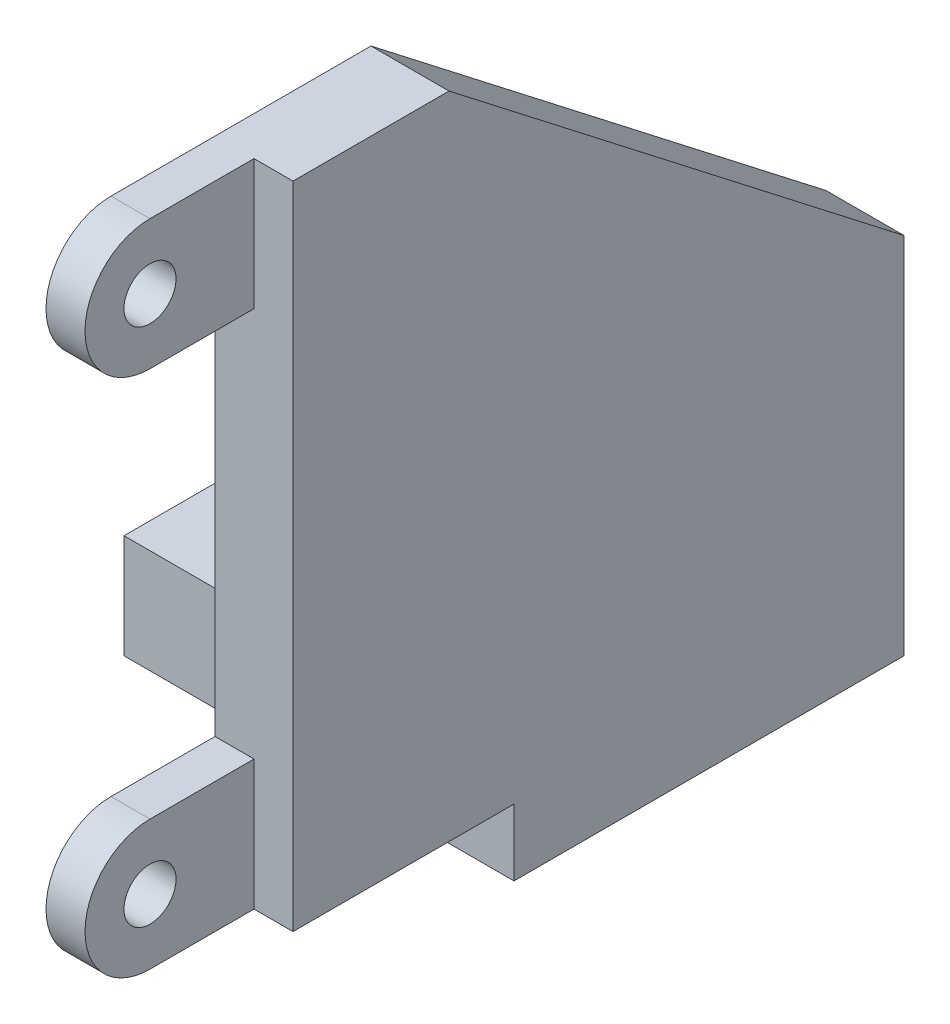
ISO-10303-21;
HEADER;
FILE_DESCRIPTION(('STEP AP214'),'2;1');
FILE_NAME('part.step','',(''),(''),'','','');
FILE_SCHEMA(('AUTOMOTIVE_DESIGN { 1 0 10303 214 1 1 1 1 }'));
ENDSEC;
DATA;
#1=APPLICATION_CONTEXT('core data for automotive mechanical design processes');
#2=APPLICATION_PROTOCOL_DEFINITION('international standard','automotive_design',2000,#1);
#3=PRODUCT_CONTEXT('',#1,'mechanical');
#4=PRODUCT('Part','Part','',(#3));
#5=PRODUCT_RELATED_PRODUCT_CATEGORY('part','',(#4));
#6=PRODUCT_DEFINITION_FORMATION('','',#4);
#7=PRODUCT_DEFINITION_CONTEXT('part definition',#1,'design');
#8=PRODUCT_DEFINITION('design','',#6,#7);
#9=PRODUCT_DEFINITION_SHAPE('','',#8);
#10=(LENGTH_UNIT() NAMED_UNIT(*) SI_UNIT(.MILLI.,.METRE.));
#11=(NAMED_UNIT(*) PLANE_ANGLE_UNIT() SI_UNIT($,.RADIAN.));
#12=(NAMED_UNIT(*) SI_UNIT($,.STERADIAN.) SOLID_ANGLE_UNIT());
#13=UNCERTAINTY_MEASURE_WITH_UNIT(LENGTH_MEASURE(1.E-05),#10,'distance_accuracy_value','');
#14=(GEOMETRIC_REPRESENTATION_CONTEXT(3) GLOBAL_UNCERTAINTY_ASSIGNED_CONTEXT((#13)) GLOBAL_UNIT_ASSIGNED_CONTEXT((#10,
#11,#12)) REPRESENTATION_CONTEXT('',''));
#15=CARTESIAN_POINT('',(0.,0.,0.));
#16=DIRECTION('',(0.,0.,1.));
#17=DIRECTION('',(1.,0.,0.));
#18=AXIS2_PLACEMENT_3D('',#15,#16,#17);
#19=CARTESIAN_POINT('',(0.,8.,-15.));
#20=DIRECTION('',(-1.,0.,0.));
#21=DIRECTION('',(0.,0.,1.));
#22=AXIS2_PLACEMENT_3D('',#19,#20,#21);
#23=PLANE('',#22);
#24=DIRECTION('',(0.,-1.,0.));
#25=VECTOR('',#24,1.);
#26=CARTESIAN_POINT('',(0.,15.125,32.));
#27=LINE('',#26,#25);
#28=CARTESIAN_POINT('',(0.,55.125,32.));
#29=VERTEX_POINT('',#28);
#30=CARTESIAN_POINT('',(0.,5.125,32.));
#31=VERTEX_POINT('',#30);
#32=EDGE_CURVE('E228',#29,#31,#27,.T.);
#33=ORIENTED_EDGE('',*,*,#32,.T.);
#34=DIRECTION('',(0.,0.,-1.));
#35=VECTOR('',#34,1.);
#36=CARTESIAN_POINT('',(0.,5.125,15.));
#37=LINE('',#36,#35);
#38=CARTESIAN_POINT('',(0.,5.125,15.));
#39=VERTEX_POINT('',#38);
#40=EDGE_CURVE('E166',#31,#39,#37,.T.);
#41=ORIENTED_EDGE('',*,*,#40,.T.);
#42=DIRECTION('',(0.,-1.,0.));
#43=VECTOR('',#42,1.);
#44=CARTESIAN_POINT('',(0.,8.,15.));
#45=LINE('',#44,#43);
#46=CARTESIAN_POINT('',(0.,0.,15.));
#47=VERTEX_POINT('',#46);
#48=EDGE_CURVE('E267',#39,#47,#45,.T.);
#49=ORIENTED_EDGE('',*,*,#48,.T.);
#50=DIRECTION('',(0.,0.,-1.));
#51=VECTOR('',#50,1.);
#52=CARTESIAN_POINT('',(0.,0.,-15.));
#53=LINE('',#52,#51);
#54=CARTESIAN_POINT('',(0.,0.,-15.));
#55=VERTEX_POINT('',#54);
#56=EDGE_CURVE('E258',#47,#55,#53,.T.);
#57=ORIENTED_EDGE('',*,*,#56,.T.);
#58=DIRECTION('',(0.,-1.,0.));
#59=VECTOR('',#58,1.);
#60=CARTESIAN_POINT('',(0.,8.,-15.));
#61=LINE('',#60,#59);
#62=CARTESIAN_POINT('',(0.,28.,-15.));
#63=VERTEX_POINT('',#62);
#64=EDGE_CURVE('E283',#63,#55,#61,.T.);
#65=ORIENTED_EDGE('',*,*,#64,.F.);
#66=DIRECTION('',(0.,0.612571665435814,0.790415052175244));
#67=VECTOR('',#66,1.);
#68=CARTESIAN_POINT('',(0.,55.125,20.));
#69=LINE('',#68,#67);
#70=CARTESIAN_POINT('',(0.,55.125,20.));
#71=VERTEX_POINT('',#70);
#72=EDGE_CURVE('E190',#63,#71,#69,.T.);
#73=ORIENTED_EDGE('',*,*,#72,.T.);
#74=DIRECTION('',(0.,0.,1.));
#75=VECTOR('',#74,1.);
#76=CARTESIAN_POINT('',(0.,55.125,40.));
#77=LINE('',#76,#75);
#78=EDGE_CURVE('E225',#71,#29,#77,.T.);
#79=ORIENTED_EDGE('',*,*,#78,.T.);
#80=EDGE_LOOP('',(#33,#41,#49,#57,#65,#73,#79));
#81=FACE_BOUND('',#80,.T.);
#82=ADVANCED_FACE('F37',(#81),#23,.F.);
#83=CARTESIAN_POINT('',(-6.,5.125,15.));
#84=DIRECTION('',(0.,-1.,0.));
#85=DIRECTION('',(0.,0.,-1.));
#86=AXIS2_PLACEMENT_3D('',#83,#84,#85);
#87=PLANE('',#86);
#88=ORIENTED_EDGE('',*,*,#40,.F.);
#89=DIRECTION('',(1.,0.,0.));
#90=VECTOR('',#89,1.);
#91=CARTESIAN_POINT('',(-3.,5.125,32.));
#92=LINE('',#91,#90);
#93=CARTESIAN_POINT('',(-3.,5.125,32.));
#94=VERTEX_POINT('',#93);
#95=EDGE_CURVE('E150',#94,#31,#92,.T.);
#96=ORIENTED_EDGE('',*,*,#95,.F.);
#97=DIRECTION('',(0.,0.,1.));
#98=VECTOR('',#97,1.);
#99=CARTESIAN_POINT('',(-3.,5.125,-15.));
#100=LINE('',#99,#98);
#101=CARTESIAN_POINT('',(-3.,5.125,40.));
#102=VERTEX_POINT('',#101);
#103=EDGE_CURVE('E156',#94,#102,#100,.T.);
#104=ORIENTED_EDGE('',*,*,#103,.T.);
#105=DIRECTION('',(1.,0.,0.));
#106=VECTOR('',#105,1.);
#107=CARTESIAN_POINT('',(-6.,5.125,40.));
#108=LINE('',#107,#106);
#109=CARTESIAN_POINT('',(-6.,5.125,40.));
#110=VERTEX_POINT('',#109);
#111=EDGE_CURVE('E234',#110,#102,#108,.T.);
#112=ORIENTED_EDGE('',*,*,#111,.F.);
#113=DIRECTION('',(0.,0.,-1.));
#114=VECTOR('',#113,1.);
#115=CARTESIAN_POINT('',(-6.,5.125,15.));
#116=LINE('',#115,#114);
#117=CARTESIAN_POINT('',(-6.,5.125,15.));
#118=VERTEX_POINT('',#117);
#119=EDGE_CURVE('E217',#110,#118,#116,.T.);
#120=ORIENTED_EDGE('',*,*,#119,.T.);
#121=DIRECTION('',(1.,0.,0.));
#122=VECTOR('',#121,1.);
#123=CARTESIAN_POINT('',(-6.,5.125,15.));
#124=LINE('',#123,#122);
#125=EDGE_CURVE('E231',#118,#39,#124,.T.);
#126=ORIENTED_EDGE('',*,*,#125,.T.);
#127=EDGE_LOOP('',(#88,#96,#104,#112,#120,#126));
#128=FACE_BOUND('',#127,.T.);
#129=ADVANCED_FACE('F164',(#128),#87,.T.);
#130=CARTESIAN_POINT('',(-6.,55.125,40.));
#131=DIRECTION('',(0.,1.,0.));
#132=DIRECTION('',(0.,0.,1.));
#133=AXIS2_PLACEMENT_3D('',#130,#131,#132);
#134=PLANE('',#133);
#135=DIRECTION('',(0.,0.,-1.));
#136=VECTOR('',#135,1.);
#137=CARTESIAN_POINT('',(-3.,55.125,-15.));
#138=LINE('',#137,#136);
#139=CARTESIAN_POINT('',(-3.,55.125,40.));
#140=VERTEX_POINT('',#139);
#141=CARTESIAN_POINT('',(-3.,55.125,32.));
#142=VERTEX_POINT('',#141);
#143=EDGE_CURVE('E162',#140,#142,#138,.T.);
#144=ORIENTED_EDGE('',*,*,#143,.T.);
#145=DIRECTION('',(1.,0.,0.));
#146=VECTOR('',#145,1.);
#147=CARTESIAN_POINT('',(-3.,55.125,32.));
#148=LINE('',#147,#146);
#149=EDGE_CURVE('E167',#142,#29,#148,.T.);
#150=ORIENTED_EDGE('',*,*,#149,.T.);
#151=ORIENTED_EDGE('',*,*,#78,.F.);
#152=DIRECTION('',(1.,0.,0.));
#153=VECTOR('',#152,1.);
#154=CARTESIAN_POINT('',(-6.,55.125,20.));
#155=LINE('',#154,#153);
#156=CARTESIAN_POINT('',(-6.,55.125,20.));
#157=VERTEX_POINT('',#156);
#158=EDGE_CURVE('E249',#157,#71,#155,.T.);
#159=ORIENTED_EDGE('',*,*,#158,.F.);
#160=DIRECTION('',(0.,0.,1.));
#161=VECTOR('',#160,1.);
#162=CARTESIAN_POINT('',(-6.,55.125,40.));
#163=LINE('',#162,#161);
#164=CARTESIAN_POINT('',(-6.,55.125,40.));
#165=VERTEX_POINT('',#164);
#166=EDGE_CURVE('E200',#157,#165,#163,.T.);
#167=ORIENTED_EDGE('',*,*,#166,.T.);
#168=DIRECTION('',(1.,0.,0.));
#169=VECTOR('',#168,1.);
#170=CARTESIAN_POINT('',(-6.,55.125,40.));
#171=LINE('',#170,#169);
#172=EDGE_CURVE('E246',#165,#140,#171,.T.);
#173=ORIENTED_EDGE('',*,*,#172,.T.);
#174=EDGE_LOOP('',(#144,#150,#151,#159,#167,#173));
#175=FACE_BOUND('',#174,.T.);
#176=ADVANCED_FACE('F324',(#175),#134,.T.);
#177=CARTESIAN_POINT('',(0.,8.,0.));
#178=DIRECTION('',(0.,-1.,0.));
#179=DIRECTION('',(0.,0.,-1.));
#180=AXIS2_PLACEMENT_3D('',#177,#178,#179);
#181=PLANE('',#180);
#182=CARTESIAN_POINT('',(-17.,8.,7.5));
#183=DIRECTION('',(0.,-1.,0.));
#184=DIRECTION('',(0.,0.,-1.));
#185=AXIS2_PLACEMENT_3D('',#182,#183,#184);
#186=CIRCLE('',#185,5.00000000000002);
#187=CARTESIAN_POINT('',(-17.,8.,12.5));
#188=VERTEX_POINT('',#187);
#189=EDGE_CURVE('E47',#188,#188,#186,.T.);
#190=ORIENTED_EDGE('',*,*,#189,.T.);
#191=EDGE_LOOP('',(#190));
#192=FACE_BOUND('',#191,.T.);
#193=CARTESIAN_POINT('',(-17.,8.,-7.5));
#194=DIRECTION('',(0.,-1.,0.));
#195=DIRECTION('',(0.,0.,-1.));
#196=AXIS2_PLACEMENT_3D('',#193,#194,#195);
#197=CIRCLE('',#196,5.00000000000002);
#198=CARTESIAN_POINT('',(-17.,8.,-2.49999999999998));
#199=VERTEX_POINT('',#198);
#200=EDGE_CURVE('E289',#199,#199,#197,.T.);
#201=ORIENTED_EDGE('',*,*,#200,.T.);
#202=EDGE_LOOP('',(#201));
#203=FACE_BOUND('',#202,.T.);
#204=DIRECTION('',(0.,0.,-1.));
#205=VECTOR('',#204,1.);
#206=CARTESIAN_POINT('',(-6.,8.,15.));
#207=LINE('',#206,#205);
#208=CARTESIAN_POINT('',(-6.,8.,15.));
#209=VERTEX_POINT('',#208);
#210=CARTESIAN_POINT('',(-6.,8.,-15.));
#211=VERTEX_POINT('',#210);
#212=EDGE_CURVE('E191',#209,#211,#207,.T.);
#213=ORIENTED_EDGE('',*,*,#212,.T.);
#214=DIRECTION('',(-1.,0.,0.));
#215=VECTOR('',#214,1.);
#216=CARTESIAN_POINT('',(0.,8.,-15.));
#217=LINE('',#216,#215);
#218=CARTESIAN_POINT('',(-30.,8.,-15.));
#219=VERTEX_POINT('',#218);
#220=EDGE_CURVE('E259',#211,#219,#217,.T.);
#221=ORIENTED_EDGE('',*,*,#220,.T.);
#222=DIRECTION('',(0.,0.,1.));
#223=VECTOR('',#222,1.);
#224=CARTESIAN_POINT('',(-30.,8.,-15.));
#225=LINE('',#224,#223);
#226=CARTESIAN_POINT('',(-30.,8.,15.));
#227=VERTEX_POINT('',#226);
#228=EDGE_CURVE('E261',#219,#227,#225,.T.);
#229=ORIENTED_EDGE('',*,*,#228,.T.);
#230=DIRECTION('',(1.,0.,0.));
#231=VECTOR('',#230,1.);
#232=CARTESIAN_POINT('',(0.,8.,15.));
#233=LINE('',#232,#231);
#234=EDGE_CURVE('E264',#227,#209,#233,.T.);
#235=ORIENTED_EDGE('',*,*,#234,.T.);
#236=EDGE_LOOP('',(#213,#221,#229,#235));
#237=FACE_BOUND('',#236,.T.);
#238=ADVANCED_FACE('F295',(#192,#203,#237),#181,.F.);
#239=CARTESIAN_POINT('',(0.,0.,0.));
#240=DIRECTION('',(0.,-1.,0.));
#241=DIRECTION('',(0.,0.,-1.));
#242=AXIS2_PLACEMENT_3D('',#239,#240,#241);
#243=PLANE('',#242);
#244=CARTESIAN_POINT('',(-17.,0.,-7.5));
#245=DIRECTION('',(0.,1.,0.));
#246=DIRECTION('',(0.,0.,-1.));
#247=AXIS2_PLACEMENT_3D('',#244,#245,#246);
#248=CIRCLE('',#247,2.);
#249=CARTESIAN_POINT('',(-17.,0.,-9.5));
#250=VERTEX_POINT('',#249);
#251=EDGE_CURVE('E255',#250,#250,#248,.T.);
#252=ORIENTED_EDGE('',*,*,#251,.T.);
#253=EDGE_LOOP('',(#252));
#254=FACE_BOUND('',#253,.T.);
#255=ORIENTED_EDGE('',*,*,#56,.F.);
#256=DIRECTION('',(1.,0.,0.));
#257=VECTOR('',#256,1.);
#258=CARTESIAN_POINT('',(0.,0.,15.));
#259=LINE('',#258,#257);
#260=CARTESIAN_POINT('',(-30.,0.,15.));
#261=VERTEX_POINT('',#260);
#262=EDGE_CURVE('E262',#261,#47,#259,.T.);
#263=ORIENTED_EDGE('',*,*,#262,.F.);
#264=DIRECTION('',(0.,0.,1.));
#265=VECTOR('',#264,1.);
#266=CARTESIAN_POINT('',(-30.,0.,-15.));
#267=LINE('',#266,#265);
#268=CARTESIAN_POINT('',(-30.,0.,-15.));
#269=VERTEX_POINT('',#268);
#270=EDGE_CURVE('E272',#269,#261,#267,.T.);
#271=ORIENTED_EDGE('',*,*,#270,.F.);
#272=DIRECTION('',(-1.,0.,0.));
#273=VECTOR('',#272,1.);
#274=CARTESIAN_POINT('',(0.,0.,-15.));
#275=LINE('',#274,#273);
#276=EDGE_CURVE('E270',#55,#269,#275,.T.);
#277=ORIENTED_EDGE('',*,*,#276,.F.);
#278=EDGE_LOOP('',(#255,#263,#271,#277));
#279=FACE_BOUND('',#278,.T.);
#280=CARTESIAN_POINT('',(-17.,0.,7.5));
#281=DIRECTION('',(0.,1.,0.));
#282=DIRECTION('',(0.,0.,1.));
#283=AXIS2_PLACEMENT_3D('',#280,#281,#282);
#284=CIRCLE('',#283,2.);
#285=CARTESIAN_POINT('',(-17.,0.,9.50000000000001));
#286=VERTEX_POINT('',#285);
#287=EDGE_CURVE('E233',#286,#286,#284,.T.);
#288=ORIENTED_EDGE('',*,*,#287,.T.);
#289=EDGE_LOOP('',(#288));
#290=FACE_BOUND('',#289,.T.);
#291=ADVANCED_FACE('F312',(#254,#279,#290),#243,.T.);
#292=CARTESIAN_POINT('',(0.,8.,-15.));
#293=DIRECTION('',(0.,0.,1.));
#294=DIRECTION('',(1.,0.,0.));
#295=AXIS2_PLACEMENT_3D('',#292,#293,#294);
#296=PLANE('',#295);
#297=ORIENTED_EDGE('',*,*,#276,.T.);
#298=DIRECTION('',(0.,-1.,0.));
#299=VECTOR('',#298,1.);
#300=CARTESIAN_POINT('',(-30.,8.,-15.));
#301=LINE('',#300,#299);
#302=EDGE_CURVE('E280',#219,#269,#301,.T.);
#303=ORIENTED_EDGE('',*,*,#302,.F.);
#304=ORIENTED_EDGE('',*,*,#220,.F.);
#305=DIRECTION('',(0.,1.,0.));
#306=VECTOR('',#305,1.);
#307=CARTESIAN_POINT('',(-6.,28.,-15.));
#308=LINE('',#307,#306);
#309=CARTESIAN_POINT('',(-6.,28.,-15.));
#310=VERTEX_POINT('',#309);
#311=EDGE_CURVE('E194',#211,#310,#308,.T.);
#312=ORIENTED_EDGE('',*,*,#311,.T.);
#313=DIRECTION('',(1.,0.,0.));
#314=VECTOR('',#313,1.);
#315=CARTESIAN_POINT('',(-6.,28.,-15.));
#316=LINE('',#315,#314);
#317=EDGE_CURVE('E222',#310,#63,#316,.T.);
#318=ORIENTED_EDGE('',*,*,#317,.T.);
#319=ORIENTED_EDGE('',*,*,#64,.T.);
#320=EDGE_LOOP('',(#297,#303,#304,#312,#318,#319));
#321=FACE_BOUND('',#320,.T.);
#322=ADVANCED_FACE('F314',(#321),#296,.F.);
#323=CARTESIAN_POINT('',(-30.,8.,-15.));
#324=DIRECTION('',(1.,0.,0.));
#325=DIRECTION('',(0.,0.,-1.));
#326=AXIS2_PLACEMENT_3D('',#323,#324,#325);
#327=PLANE('',#326);
#328=ORIENTED_EDGE('',*,*,#270,.T.);
#329=DIRECTION('',(0.,-1.,0.));
#330=VECTOR('',#329,1.);
#331=CARTESIAN_POINT('',(-30.,8.,15.));
#332=LINE('',#331,#330);
#333=EDGE_CURVE('E277',#227,#261,#332,.T.);
#334=ORIENTED_EDGE('',*,*,#333,.F.);
#335=ORIENTED_EDGE('',*,*,#228,.F.);
#336=ORIENTED_EDGE('',*,*,#302,.T.);
#337=EDGE_LOOP('',(#328,#334,#335,#336));
#338=FACE_BOUND('',#337,.T.);
#339=ADVANCED_FACE('F321',(#338),#327,.F.);
#340=CARTESIAN_POINT('',(0.,8.,15.));
#341=DIRECTION('',(0.,0.,-1.));
#342=DIRECTION('',(-1.,0.,0.));
#343=AXIS2_PLACEMENT_3D('',#340,#341,#342);
#344=PLANE('',#343);
#345=ORIENTED_EDGE('',*,*,#48,.F.);
#346=ORIENTED_EDGE('',*,*,#125,.F.);
#347=DIRECTION('',(0.,1.,0.));
#348=VECTOR('',#347,1.);
#349=CARTESIAN_POINT('',(-6.,8.,15.));
#350=LINE('',#349,#348);
#351=EDGE_CURVE('E219',#118,#209,#350,.T.);
#352=ORIENTED_EDGE('',*,*,#351,.T.);
#353=ORIENTED_EDGE('',*,*,#234,.F.);
#354=ORIENTED_EDGE('',*,*,#333,.T.);
#355=ORIENTED_EDGE('',*,*,#262,.T.);
#356=EDGE_LOOP('',(#345,#346,#352,#353,#354,#355));
#357=FACE_BOUND('',#356,.T.);
#358=ADVANCED_FACE('F342',(#357),#344,.F.);
#359=CARTESIAN_POINT('',(-17.,8.,-7.5));
#360=DIRECTION('',(0.,-1.,0.));
#361=DIRECTION('',(0.,0.,-1.));
#362=AXIS2_PLACEMENT_3D('',#359,#360,#361);
#363=CYLINDRICAL_SURFACE('',#362,2.);
#364=CARTESIAN_POINT('',(-17.,4.99999999999999,-7.5));
#365=DIRECTION('',(0.,-1.,0.));
#366=DIRECTION('',(0.,0.,-1.));
#367=AXIS2_PLACEMENT_3D('',#364,#365,#366);
#368=CIRCLE('',#367,2.);
#369=CARTESIAN_POINT('',(-17.,4.99999999999999,-5.49999999999999));
#370=VERTEX_POINT('',#369);
#371=EDGE_CURVE('E11',#370,#370,#368,.F.);
#372=ORIENTED_EDGE('',*,*,#371,.T.);
#373=EDGE_LOOP('',(#372));
#374=FACE_BOUND('',#373,.T.);
#375=ORIENTED_EDGE('',*,*,#251,.F.);
#376=EDGE_LOOP('',(#375));
#377=FACE_BOUND('',#376,.T.);
#378=ADVANCED_FACE('F308',(#374,#377),#363,.F.);
#379=CARTESIAN_POINT('',(-17.,8.,7.5));
#380=DIRECTION('',(0.,-1.,0.));
#381=DIRECTION('',(0.,0.,-1.));
#382=AXIS2_PLACEMENT_3D('',#379,#380,#381);
#383=CYLINDRICAL_SURFACE('',#382,2.);
#384=CARTESIAN_POINT('',(-17.,4.99999999999999,7.5));
#385=DIRECTION('',(0.,-1.,0.));
#386=DIRECTION('',(0.,0.,-1.));
#387=AXIS2_PLACEMENT_3D('',#384,#385,#386);
#388=CIRCLE('',#387,2.);
#389=CARTESIAN_POINT('',(-17.,4.99999999999999,9.50000000000001));
#390=VERTEX_POINT('',#389);
#391=EDGE_CURVE('E286',#390,#390,#388,.F.);
#392=ORIENTED_EDGE('',*,*,#391,.T.);
#393=EDGE_LOOP('',(#392));
#394=FACE_BOUND('',#393,.T.);
#395=ORIENTED_EDGE('',*,*,#287,.F.);
#396=EDGE_LOOP('',(#395));
#397=FACE_BOUND('',#396,.T.);
#398=ADVANCED_FACE('F304',(#394,#397),#383,.F.);
#399=CARTESIAN_POINT('',(-6.,10.125,40.));
#400=DIRECTION('',(1.,0.,0.));
#401=DIRECTION('',(0.,0.,-1.));
#402=AXIS2_PLACEMENT_3D('',#399,#400,#401);
#403=CYLINDRICAL_SURFACE('',#402,5.);
#404=CARTESIAN_POINT('',(-3.,10.125,40.));
#405=DIRECTION('',(-1.,0.,0.));
#406=DIRECTION('',(0.,0.,1.));
#407=AXIS2_PLACEMENT_3D('',#404,#405,#406);
#408=CIRCLE('',#407,5.);
#409=CARTESIAN_POINT('',(-3.,15.125,40.));
#410=VERTEX_POINT('',#409);
#411=EDGE_CURVE('E159',#410,#102,#408,.F.);
#412=ORIENTED_EDGE('',*,*,#411,.F.);
#413=DIRECTION('',(1.,0.,0.));
#414=VECTOR('',#413,1.);
#415=CARTESIAN_POINT('',(-6.,15.125,40.));
#416=LINE('',#415,#414);
#417=CARTESIAN_POINT('',(-6.,15.125,40.));
#418=VERTEX_POINT('',#417);
#419=EDGE_CURVE('E236',#418,#410,#416,.T.);
#420=ORIENTED_EDGE('',*,*,#419,.F.);
#421=CARTESIAN_POINT('',(-6.,10.125,40.));
#422=DIRECTION('',(1.,0.,0.));
#423=DIRECTION('',(0.,0.,-1.));
#424=AXIS2_PLACEMENT_3D('',#421,#422,#423);
#425=CIRCLE('',#424,5.);
#426=EDGE_CURVE('E214',#418,#110,#425,.T.);
#427=ORIENTED_EDGE('',*,*,#426,.T.);
#428=ORIENTED_EDGE('',*,*,#111,.T.);
#429=EDGE_LOOP('',(#412,#420,#427,#428));
#430=FACE_BOUND('',#429,.T.);
#431=ADVANCED_FACE('F307',(#430),#403,.T.);
#432=CARTESIAN_POINT('',(-6.,15.125,40.));
#433=DIRECTION('',(0.,1.,0.));
#434=DIRECTION('',(0.,0.,1.));
#435=AXIS2_PLACEMENT_3D('',#432,#433,#434);
#436=PLANE('',#435);
#437=DIRECTION('',(0.,0.,1.));
#438=VECTOR('',#437,1.);
#439=CARTESIAN_POINT('',(-3.,15.125,40.));
#440=LINE('',#439,#438);
#441=CARTESIAN_POINT('',(-3.,15.125,32.));
#442=VERTEX_POINT('',#441);
#443=EDGE_CURVE('E181',#442,#410,#440,.T.);
#444=ORIENTED_EDGE('',*,*,#443,.F.);
#445=DIRECTION('',(1.,0.,0.));
#446=VECTOR('',#445,1.);
#447=CARTESIAN_POINT('',(-6.,15.125,32.));
#448=LINE('',#447,#446);
#449=CARTESIAN_POINT('',(-6.,15.125,32.));
#450=VERTEX_POINT('',#449);
#451=EDGE_CURVE('E153',#450,#442,#448,.T.);
#452=ORIENTED_EDGE('',*,*,#451,.F.);
#453=DIRECTION('',(0.,0.,1.));
#454=VECTOR('',#453,1.);
#455=CARTESIAN_POINT('',(-6.,15.125,40.));
#456=LINE('',#455,#454);
#457=EDGE_CURVE('E211',#450,#418,#456,.T.);
#458=ORIENTED_EDGE('',*,*,#457,.T.);
#459=ORIENTED_EDGE('',*,*,#419,.T.);
#460=EDGE_LOOP('',(#444,#452,#458,#459));
#461=FACE_BOUND('',#460,.T.);
#462=ADVANCED_FACE('F409',(#461),#436,.T.);
#463=CARTESIAN_POINT('',(-6.,15.125,32.));
#464=DIRECTION('',(0.,0.,1.));
#465=DIRECTION('',(1.,0.,0.));
#466=AXIS2_PLACEMENT_3D('',#463,#464,#465);
#467=PLANE('',#466);
#468=ORIENTED_EDGE('',*,*,#451,.T.);
#469=DIRECTION('',(0.,-1.,0.));
#470=VECTOR('',#469,1.);
#471=CARTESIAN_POINT('',(-3.,8.,32.));
#472=LINE('',#471,#470);
#473=EDGE_CURVE('E54',#442,#94,#472,.T.);
#474=ORIENTED_EDGE('',*,*,#473,.T.);
#475=ORIENTED_EDGE('',*,*,#95,.T.);
#476=ORIENTED_EDGE('',*,*,#32,.F.);
#477=ORIENTED_EDGE('',*,*,#149,.F.);
#478=CARTESIAN_POINT('',(-3.,45.125,32.));
#479=VERTEX_POINT('',#478);
#480=EDGE_CURVE('E62',#142,#479,#472,.T.);
#481=ORIENTED_EDGE('',*,*,#480,.T.);
#482=DIRECTION('',(1.,0.,0.));
#483=VECTOR('',#482,1.);
#484=CARTESIAN_POINT('',(-6.,45.125,32.));
#485=LINE('',#484,#483);
#486=CARTESIAN_POINT('',(-6.,45.125,32.));
#487=VERTEX_POINT('',#486);
#488=EDGE_CURVE('E240',#487,#479,#485,.T.);
#489=ORIENTED_EDGE('',*,*,#488,.F.);
#490=DIRECTION('',(0.,-1.,0.));
#491=VECTOR('',#490,1.);
#492=CARTESIAN_POINT('',(-6.,15.125,32.));
#493=LINE('',#492,#491);
#494=EDGE_CURVE('E209',#487,#450,#493,.T.);
#495=ORIENTED_EDGE('',*,*,#494,.T.);
#496=EDGE_LOOP('',(#468,#474,#475,#476,#477,#481,#489,#495));
#497=FACE_BOUND('',#496,.T.);
#498=ADVANCED_FACE('F148',(#497),#467,.T.);
#499=CARTESIAN_POINT('',(-6.,45.125,32.));
#500=DIRECTION('',(0.,-1.,0.));
#501=DIRECTION('',(0.,0.,-1.));
#502=AXIS2_PLACEMENT_3D('',#499,#500,#501);
#503=PLANE('',#502);
#504=DIRECTION('',(0.,0.,-1.));
#505=VECTOR('',#504,1.);
#506=CARTESIAN_POINT('',(-3.,45.125,32.));
#507=LINE('',#506,#505);
#508=CARTESIAN_POINT('',(-3.,45.125,40.));
#509=VERTEX_POINT('',#508);
#510=EDGE_CURVE('E179',#509,#479,#507,.T.);
#511=ORIENTED_EDGE('',*,*,#510,.F.);
#512=DIRECTION('',(1.,0.,0.));
#513=VECTOR('',#512,1.);
#514=CARTESIAN_POINT('',(-6.,45.125,40.));
#515=LINE('',#514,#513);
#516=CARTESIAN_POINT('',(-6.,45.125,40.));
#517=VERTEX_POINT('',#516);
#518=EDGE_CURVE('E243',#517,#509,#515,.T.);
#519=ORIENTED_EDGE('',*,*,#518,.F.);
#520=DIRECTION('',(0.,0.,-1.));
#521=VECTOR('',#520,1.);
#522=CARTESIAN_POINT('',(-6.,45.125,32.));
#523=LINE('',#522,#521);
#524=EDGE_CURVE('E206',#517,#487,#523,.T.);
#525=ORIENTED_EDGE('',*,*,#524,.T.);
#526=ORIENTED_EDGE('',*,*,#488,.T.);
#527=EDGE_LOOP('',(#511,#519,#525,#526));
#528=FACE_BOUND('',#527,.T.);
#529=ADVANCED_FACE('F378',(#528),#503,.T.);
#530=CARTESIAN_POINT('',(-6.,50.125,40.));
#531=DIRECTION('',(1.,0.,0.));
#532=DIRECTION('',(0.,0.,-1.));
#533=AXIS2_PLACEMENT_3D('',#530,#531,#532);
#534=CYLINDRICAL_SURFACE('',#533,5.00000000000001);
#535=CARTESIAN_POINT('',(-3.,50.125,40.));
#536=DIRECTION('',(-1.,0.,0.));
#537=DIRECTION('',(0.,0.,1.));
#538=AXIS2_PLACEMENT_3D('',#535,#536,#537);
#539=CIRCLE('',#538,5.00000000000001);
#540=EDGE_CURVE('E177',#140,#509,#539,.F.);
#541=ORIENTED_EDGE('',*,*,#540,.F.);
#542=ORIENTED_EDGE('',*,*,#172,.F.);
#543=CARTESIAN_POINT('',(-6.,50.125,40.));
#544=DIRECTION('',(1.,0.,0.));
#545=DIRECTION('',(0.,0.,-1.));
#546=AXIS2_PLACEMENT_3D('',#543,#544,#545);
#547=CIRCLE('',#546,5.00000000000001);
#548=EDGE_CURVE('E203',#165,#517,#547,.T.);
#549=ORIENTED_EDGE('',*,*,#548,.T.);
#550=ORIENTED_EDGE('',*,*,#518,.T.);
#551=EDGE_LOOP('',(#541,#542,#549,#550));
#552=FACE_BOUND('',#551,.T.);
#553=ADVANCED_FACE('F383',(#552),#534,.T.);
#554=CARTESIAN_POINT('',(-6.,55.125,20.));
#555=DIRECTION('',(0.,0.790415052175244,-0.612571665435814));
#556=DIRECTION('',(0.,0.612571665435814,0.790415052175244));
#557=AXIS2_PLACEMENT_3D('',#554,#555,#556);
#558=PLANE('',#557);
#559=ORIENTED_EDGE('',*,*,#72,.F.);
#560=ORIENTED_EDGE('',*,*,#317,.F.);
#561=DIRECTION('',(0.,0.612571665435814,0.790415052175244));
#562=VECTOR('',#561,1.);
#563=CARTESIAN_POINT('',(-6.,55.125,20.));
#564=LINE('',#563,#562);
#565=EDGE_CURVE('E197',#310,#157,#564,.T.);
#566=ORIENTED_EDGE('',*,*,#565,.T.);
#567=ORIENTED_EDGE('',*,*,#158,.T.);
#568=EDGE_LOOP('',(#559,#560,#566,#567));
#569=FACE_BOUND('',#568,.T.);
#570=ADVANCED_FACE('F370',(#569),#558,.T.);
#571=CARTESIAN_POINT('',(-6.,50.125,40.));
#572=DIRECTION('',(1.,0.,0.));
#573=DIRECTION('',(0.,0.,-1.));
#574=AXIS2_PLACEMENT_3D('',#571,#572,#573);
#575=PLANE('',#574);
#576=CARTESIAN_POINT('',(-6.,50.125,40.));
#577=DIRECTION('',(1.,0.,0.));
#578=DIRECTION('',(0.,0.,-1.));
#579=AXIS2_PLACEMENT_3D('',#576,#577,#578);
#580=CIRCLE('',#579,2.);
#581=CARTESIAN_POINT('',(-6.,50.125,38.));
#582=VERTEX_POINT('',#581);
#583=EDGE_CURVE('E184',#582,#582,#580,.T.);
#584=ORIENTED_EDGE('',*,*,#583,.T.);
#585=EDGE_LOOP('',(#584));
#586=FACE_BOUND('',#585,.T.);
#587=CARTESIAN_POINT('',(-6.,10.125,40.));
#588=DIRECTION('',(1.,0.,0.));
#589=DIRECTION('',(0.,0.,-1.));
#590=AXIS2_PLACEMENT_3D('',#587,#588,#589);
#591=CIRCLE('',#590,2.);
#592=CARTESIAN_POINT('',(-6.,10.125,38.));
#593=VERTEX_POINT('',#592);
#594=EDGE_CURVE('E187',#593,#593,#591,.T.);
#595=ORIENTED_EDGE('',*,*,#594,.T.);
#596=EDGE_LOOP('',(#595));
#597=FACE_BOUND('',#596,.T.);
#598=ORIENTED_EDGE('',*,*,#212,.F.);
#599=ORIENTED_EDGE('',*,*,#351,.F.);
#600=ORIENTED_EDGE('',*,*,#119,.F.);
#601=ORIENTED_EDGE('',*,*,#426,.F.);
#602=ORIENTED_EDGE('',*,*,#457,.F.);
#603=ORIENTED_EDGE('',*,*,#494,.F.);
#604=ORIENTED_EDGE('',*,*,#524,.F.);
#605=ORIENTED_EDGE('',*,*,#548,.F.);
#606=ORIENTED_EDGE('',*,*,#166,.F.);
#607=ORIENTED_EDGE('',*,*,#565,.F.);
#608=ORIENTED_EDGE('',*,*,#311,.F.);
#609=EDGE_LOOP('',(#598,#599,#600,#601,#602,#603,#604,#605,#606,#607,#608));
#610=FACE_BOUND('',#609,.T.);
#611=ADVANCED_FACE('F359',(#586,#597,#610),#575,.F.);
#612=CARTESIAN_POINT('',(-6.,10.125,40.));
#613=DIRECTION('',(1.,0.,0.));
#614=DIRECTION('',(0.,0.,-1.));
#615=AXIS2_PLACEMENT_3D('',#612,#613,#614);
#616=CYLINDRICAL_SURFACE('',#615,2.);
#617=CARTESIAN_POINT('',(-3.,10.125,40.));
#618=DIRECTION('',(-1.,0.,0.));
#619=DIRECTION('',(0.,0.,1.));
#620=AXIS2_PLACEMENT_3D('',#617,#618,#619);
#621=CIRCLE('',#620,2.);
#622=CARTESIAN_POINT('',(-3.,10.125,42.));
#623=VERTEX_POINT('',#622);
#624=EDGE_CURVE('E170',#623,#623,#621,.F.);
#625=ORIENTED_EDGE('',*,*,#624,.T.);
#626=EDGE_LOOP('',(#625));
#627=FACE_BOUND('',#626,.T.);
#628=ORIENTED_EDGE('',*,*,#594,.F.);
#629=EDGE_LOOP('',(#628));
#630=FACE_BOUND('',#629,.T.);
#631=ADVANCED_FACE('F392',(#627,#630),#616,.F.);
#632=CARTESIAN_POINT('',(-6.,50.125,40.));
#633=DIRECTION('',(1.,0.,0.));
#634=DIRECTION('',(0.,0.,-1.));
#635=AXIS2_PLACEMENT_3D('',#632,#633,#634);
#636=CYLINDRICAL_SURFACE('',#635,2.);
#637=CARTESIAN_POINT('',(-3.,50.125,40.));
#638=DIRECTION('',(-1.,0.,0.));
#639=DIRECTION('',(0.,0.,1.));
#640=AXIS2_PLACEMENT_3D('',#637,#638,#639);
#641=CIRCLE('',#640,2.);
#642=CARTESIAN_POINT('',(-3.,50.125,42.));
#643=VERTEX_POINT('',#642);
#644=EDGE_CURVE('E42',#643,#643,#641,.F.);
#645=ORIENTED_EDGE('',*,*,#644,.T.);
#646=EDGE_LOOP('',(#645));
#647=FACE_BOUND('',#646,.T.);
#648=ORIENTED_EDGE('',*,*,#583,.F.);
#649=EDGE_LOOP('',(#648));
#650=FACE_BOUND('',#649,.T.);
#651=ADVANCED_FACE('F301',(#647,#650),#636,.F.);
#652=CARTESIAN_POINT('',(-17.,4.99999999999999,7.5));
#653=DIRECTION('',(0.,1.,0.));
#654=DIRECTION('',(0.,0.,1.));
#655=AXIS2_PLACEMENT_3D('',#652,#653,#654);
#656=CONICAL_SURFACE('',#655,2.,0.785398163397448);
#657=CARTESIAN_POINT('',(-17.,8.,12.5));
#658=CARTESIAN_POINT('',(-17.,7.96875,12.46875));
#659=CARTESIAN_POINT('',(-17.,7.9375,12.4375));
#660=CARTESIAN_POINT('',(-17.,7.875,12.375));
#661=CARTESIAN_POINT('',(-17.,7.84375,12.34375));
#662=CARTESIAN_POINT('',(-17.,7.78125,12.28125));
#663=CARTESIAN_POINT('',(-17.,7.75,12.25));
#664=CARTESIAN_POINT('',(-17.,7.6875,12.1875));
#665=CARTESIAN_POINT('',(-17.,7.65625,12.15625));
#666=CARTESIAN_POINT('',(-17.,7.59375,12.09375));
#667=CARTESIAN_POINT('',(-17.,7.5625,12.0625));
#668=CARTESIAN_POINT('',(-17.,7.5,12.));
#669=CARTESIAN_POINT('',(-17.,7.46875,11.96875));
#670=CARTESIAN_POINT('',(-17.,7.40625,11.90625));
#671=CARTESIAN_POINT('',(-17.,7.375,11.875));
#672=CARTESIAN_POINT('',(-17.,7.3125,11.8125));
#673=CARTESIAN_POINT('',(-17.,7.28125,11.78125));
#674=CARTESIAN_POINT('',(-17.,7.21875,11.71875));
#675=CARTESIAN_POINT('',(-17.,7.1875,11.6875));
#676=CARTESIAN_POINT('',(-17.,7.125,11.625));
#677=CARTESIAN_POINT('',(-17.,7.09375,11.59375));
#678=CARTESIAN_POINT('',(-17.,7.03125,11.53125));
#679=CARTESIAN_POINT('',(-17.,7.,11.5));
#680=CARTESIAN_POINT('',(-17.,6.9375,11.4375));
#681=CARTESIAN_POINT('',(-17.,6.90625,11.40625));
#682=CARTESIAN_POINT('',(-17.,6.84375,11.34375));
#683=CARTESIAN_POINT('',(-17.,6.8125,11.3125));
#684=CARTESIAN_POINT('',(-17.,6.75,11.25));
#685=CARTESIAN_POINT('',(-17.,6.71875,11.21875));
#686=CARTESIAN_POINT('',(-17.,6.65625,11.15625));
#687=CARTESIAN_POINT('',(-17.,6.625,11.125));
#688=CARTESIAN_POINT('',(-17.,6.56249999999999,11.0625));
#689=CARTESIAN_POINT('',(-17.,6.53124999999999,11.03125));
#690=CARTESIAN_POINT('',(-17.,6.46874999999999,10.96875));
#691=CARTESIAN_POINT('',(-17.,6.43749999999999,10.9375));
#692=CARTESIAN_POINT('',(-17.,6.37499999999999,10.875));
#693=CARTESIAN_POINT('',(-17.,6.34374999999999,10.84375));
#694=CARTESIAN_POINT('',(-17.,6.28124999999999,10.78125));
#695=CARTESIAN_POINT('',(-17.,6.24999999999999,10.75));
#696=CARTESIAN_POINT('',(-17.,6.18749999999999,10.6875));
#697=CARTESIAN_POINT('',(-17.,6.15624999999999,10.65625));
#698=CARTESIAN_POINT('',(-17.,6.09374999999999,10.59375));
#699=CARTESIAN_POINT('',(-17.,6.06249999999999,10.5625));
#700=CARTESIAN_POINT('',(-17.,5.99999999999999,10.5));
#701=CARTESIAN_POINT('',(-17.,5.96874999999999,10.46875));
#702=CARTESIAN_POINT('',(-17.,5.90624999999999,10.40625));
#703=CARTESIAN_POINT('',(-17.,5.87499999999999,10.375));
#704=CARTESIAN_POINT('',(-17.,5.81249999999999,10.3125));
#705=CARTESIAN_POINT('',(-17.,5.78124999999999,10.28125));
#706=CARTESIAN_POINT('',(-17.,5.71874999999999,10.21875));
#707=CARTESIAN_POINT('',(-17.,5.68749999999999,10.1875));
#708=CARTESIAN_POINT('',(-17.,5.62499999999999,10.125));
#709=CARTESIAN_POINT('',(-17.,5.59374999999999,10.09375));
#710=CARTESIAN_POINT('',(-17.,5.53124999999999,10.03125));
#711=CARTESIAN_POINT('',(-17.,5.49999999999999,10.));
#712=CARTESIAN_POINT('',(-17.,5.43749999999999,9.93750000000001));
#713=CARTESIAN_POINT('',(-17.,5.40624999999999,9.90625000000001));
#714=CARTESIAN_POINT('',(-17.,5.34374999999999,9.84375000000001));
#715=CARTESIAN_POINT('',(-17.,5.31249999999999,9.81250000000001));
#716=CARTESIAN_POINT('',(-17.,5.24999999999999,9.75000000000001));
#717=CARTESIAN_POINT('',(-17.,5.21874999999999,9.71875000000001));
#718=CARTESIAN_POINT('',(-17.,5.15624999999999,9.65625000000001));
#719=CARTESIAN_POINT('',(-17.,5.12499999999999,9.62500000000001));
#720=CARTESIAN_POINT('',(-17.,5.06249999999999,9.56250000000001));
#721=CARTESIAN_POINT('',(-17.,5.03124999999999,9.53125000000001));
#722=CARTESIAN_POINT('',(-17.,4.99999999999999,9.50000000000001));
#723=B_SPLINE_CURVE_WITH_KNOTS('',3,(#657,#658,#659,#660,#661,#662,#663,#664,#665,#666,#667,
#668,#669,#670,#671,#672,#673,#674,#675,#676,#677,#678,#679,#680,#681,#682,#683,#684,#685,#686,
#687,#688,#689,#690,#691,#692,#693,#694,#695,#696,#697,#698,#699,#700,#701,#702,#703,#704,#705,
#706,#707,#708,#709,#710,#711,#712,#713,#714,#715,#716,#717,#718,#719,#720,#721,#722),
.UNSPECIFIED.,.F.,.F.,(4,2,2,2,2,2,2,2,2,2,2,2,2,2,2,2,2,2,2,2,2,2,2,2,2,2,2,2,2,2,2,2,4),(0.,
0.132582521472479,0.265165042944957,0.397747564417436,0.530330085889913,0.662912607362391,
0.795495128834872,0.928077650307349,1.06066017177983,1.19324269325231,1.32582521472478,
1.45840773619726,1.59099025766974,1.72357277914222,1.8561553006147,1.98873782208718,
2.12132034355965,2.25390286503213,2.38648538650461,2.51906790797709,2.65165042944957,
2.78423295092205,2.91681547239452,3.049397993867,3.18198051533948,3.31456303681196,
3.44714555828444,3.57972807975692,3.71231060122939,3.84489312270187,3.97747564417435,
4.11005816564683,4.24264068711931),.UNSPECIFIED.);
#724=EDGE_CURVE('BSEAM298',#188,#390,#723,.T.);
#725=ORIENTED_EDGE('',*,*,#189,.F.);
#726=ORIENTED_EDGE('',*,*,#391,.F.);
#727=ORIENTED_EDGE('',*,*,#724,.T.);
#728=ORIENTED_EDGE('',*,*,#724,.F.);
#729=EDGE_LOOP('',(#725,#727,#726,#728));
#730=FACE_BOUND('',#729,.T.);
#731=ADVANCED_FACE('F298',(#730),#656,.F.);
#732=CARTESIAN_POINT('',(-17.,4.99999999999999,-7.5));
#733=DIRECTION('',(0.,1.,0.));
#734=DIRECTION('',(0.,0.,1.));
#735=AXIS2_PLACEMENT_3D('',#732,#733,#734);
#736=CONICAL_SURFACE('',#735,2.,0.785398163397448);
#737=CARTESIAN_POINT('',(-17.,8.,-2.49999999999998));
#738=CARTESIAN_POINT('',(-17.,7.96875,-2.53124999999998));
#739=CARTESIAN_POINT('',(-17.,7.9375,-2.56249999999998));
#740=CARTESIAN_POINT('',(-17.,7.875,-2.62499999999998));
#741=CARTESIAN_POINT('',(-17.,7.84375,-2.65624999999998));
#742=CARTESIAN_POINT('',(-17.,7.78125,-2.71874999999998));
#743=CARTESIAN_POINT('',(-17.,7.75,-2.74999999999998));
#744=CARTESIAN_POINT('',(-17.,7.6875,-2.81249999999998));
#745=CARTESIAN_POINT('',(-17.,7.65625,-2.84374999999998));
#746=CARTESIAN_POINT('',(-17.,7.59375,-2.90624999999998));
#747=CARTESIAN_POINT('',(-17.,7.5625,-2.93749999999998));
#748=CARTESIAN_POINT('',(-17.,7.5,-2.99999999999998));
#749=CARTESIAN_POINT('',(-17.,7.46875,-3.03124999999998));
#750=CARTESIAN_POINT('',(-17.,7.40625,-3.09374999999998));
#751=CARTESIAN_POINT('',(-17.,7.375,-3.12499999999998));
#752=CARTESIAN_POINT('',(-17.,7.3125,-3.18749999999998));
#753=CARTESIAN_POINT('',(-17.,7.28125,-3.21874999999998));
#754=CARTESIAN_POINT('',(-17.,7.21875,-3.28124999999998));
#755=CARTESIAN_POINT('',(-17.,7.1875,-3.31249999999998));
#756=CARTESIAN_POINT('',(-17.,7.125,-3.37499999999998));
#757=CARTESIAN_POINT('',(-17.,7.09375,-3.40624999999998));
#758=CARTESIAN_POINT('',(-17.,7.03125,-3.46874999999998));
#759=CARTESIAN_POINT('',(-17.,7.,-3.49999999999998));
#760=CARTESIAN_POINT('',(-17.,6.9375,-3.56249999999998));
#761=CARTESIAN_POINT('',(-17.,6.90625,-3.59374999999998));
#762=CARTESIAN_POINT('',(-17.,6.84375,-3.65624999999998));
#763=CARTESIAN_POINT('',(-17.,6.8125,-3.68749999999998));
#764=CARTESIAN_POINT('',(-17.,6.75,-3.74999999999998));
#765=CARTESIAN_POINT('',(-17.,6.71874999999999,-3.78124999999999));
#766=CARTESIAN_POINT('',(-17.,6.65624999999999,-3.84374999999999));
#767=CARTESIAN_POINT('',(-17.,6.62499999999999,-3.87499999999999));
#768=CARTESIAN_POINT('',(-17.,6.56249999999999,-3.93749999999999));
#769=CARTESIAN_POINT('',(-17.,6.53124999999999,-3.96874999999999));
#770=CARTESIAN_POINT('',(-17.,6.46874999999999,-4.03124999999999));
#771=CARTESIAN_POINT('',(-17.,6.43749999999999,-4.06249999999999));
#772=CARTESIAN_POINT('',(-17.,6.37499999999999,-4.12499999999999));
#773=CARTESIAN_POINT('',(-17.,6.34374999999999,-4.15624999999999));
#774=CARTESIAN_POINT('',(-17.,6.28124999999999,-4.21874999999999));
#775=CARTESIAN_POINT('',(-17.,6.24999999999999,-4.24999999999999));
#776=CARTESIAN_POINT('',(-17.,6.18749999999999,-4.31249999999999));
#777=CARTESIAN_POINT('',(-17.,6.15624999999999,-4.34374999999999));
#778=CARTESIAN_POINT('',(-17.,6.09374999999999,-4.40624999999999));
#779=CARTESIAN_POINT('',(-17.,6.06249999999999,-4.43749999999999));
#780=CARTESIAN_POINT('',(-17.,5.99999999999999,-4.49999999999999));
#781=CARTESIAN_POINT('',(-17.,5.96874999999999,-4.53124999999999));
#782=CARTESIAN_POINT('',(-17.,5.90624999999999,-4.59374999999999));
#783=CARTESIAN_POINT('',(-17.,5.87499999999999,-4.62499999999999));
#784=CARTESIAN_POINT('',(-17.,5.81249999999999,-4.68749999999999));
#785=CARTESIAN_POINT('',(-17.,5.78124999999999,-4.71874999999999));
#786=CARTESIAN_POINT('',(-17.,5.71874999999999,-4.78124999999999));
#787=CARTESIAN_POINT('',(-17.,5.68749999999999,-4.81249999999999));
#788=CARTESIAN_POINT('',(-17.,5.62499999999999,-4.87499999999999));
#789=CARTESIAN_POINT('',(-17.,5.59374999999999,-4.90624999999999));
#790=CARTESIAN_POINT('',(-17.,5.53124999999999,-4.96874999999999));
#791=CARTESIAN_POINT('',(-17.,5.49999999999999,-4.99999999999999));
#792=CARTESIAN_POINT('',(-17.,5.43749999999999,-5.06249999999999));
#793=CARTESIAN_POINT('',(-17.,5.40624999999999,-5.09374999999999));
#794=CARTESIAN_POINT('',(-17.,5.34374999999999,-5.15624999999999));
#795=CARTESIAN_POINT('',(-17.,5.31249999999999,-5.18749999999999));
#796=CARTESIAN_POINT('',(-17.,5.24999999999999,-5.24999999999999));
#797=CARTESIAN_POINT('',(-17.,5.21874999999999,-5.28124999999999));
#798=CARTESIAN_POINT('',(-17.,5.15624999999999,-5.34374999999999));
#799=CARTESIAN_POINT('',(-17.,5.12499999999999,-5.37499999999999));
#800=CARTESIAN_POINT('',(-17.,5.06249999999999,-5.43749999999999));
#801=CARTESIAN_POINT('',(-17.,5.03124999999999,-5.46874999999999));
#802=CARTESIAN_POINT('',(-17.,4.99999999999999,-5.49999999999999));
#803=B_SPLINE_CURVE_WITH_KNOTS('',3,(#737,#738,#739,#740,#741,#742,#743,#744,#745,#746,#747,
#748,#749,#750,#751,#752,#753,#754,#755,#756,#757,#758,#759,#760,#761,#762,#763,#764,#765,#766,
#767,#768,#769,#770,#771,#772,#773,#774,#775,#776,#777,#778,#779,#780,#781,#782,#783,#784,#785,
#786,#787,#788,#789,#790,#791,#792,#793,#794,#795,#796,#797,#798,#799,#800,#801,#802),
.UNSPECIFIED.,.F.,.F.,(4,2,2,2,2,2,2,2,2,2,2,2,2,2,2,2,2,2,2,2,2,2,2,2,2,2,2,2,2,2,2,2,4),(0.,
0.132582521472479,0.265165042944957,0.397747564417436,0.530330085889913,0.662912607362392,
0.795495128834871,0.928077650307349,1.06066017177983,1.19324269325231,1.32582521472478,
1.45840773619726,1.59099025766974,1.72357277914222,1.8561553006147,1.98873782208718,
2.12132034355965,2.25390286503213,2.38648538650461,2.51906790797709,2.65165042944957,
2.78423295092205,2.91681547239452,3.049397993867,3.18198051533948,3.31456303681196,
3.44714555828444,3.57972807975692,3.7123106012294,3.84489312270187,3.97747564417435,
4.11005816564683,4.24264068711931),.UNSPECIFIED.);
#804=EDGE_CURVE('BSEAM40',#199,#370,#803,.T.);
#805=ORIENTED_EDGE('',*,*,#200,.F.);
#806=ORIENTED_EDGE('',*,*,#371,.F.);
#807=ORIENTED_EDGE('',*,*,#804,.T.);
#808=ORIENTED_EDGE('',*,*,#804,.F.);
#809=EDGE_LOOP('',(#805,#807,#806,#808));
#810=FACE_BOUND('',#809,.T.);
#811=ADVANCED_FACE('F40',(#810),#736,.F.);
#812=CARTESIAN_POINT('',(-3.,0.,0.));
#813=DIRECTION('',(-1.,0.,0.));
#814=DIRECTION('',(0.,0.,1.));
#815=AXIS2_PLACEMENT_3D('',#812,#813,#814);
#816=PLANE('',#815);
#817=ORIENTED_EDGE('',*,*,#510,.T.);
#818=ORIENTED_EDGE('',*,*,#480,.F.);
#819=ORIENTED_EDGE('',*,*,#143,.F.);
#820=ORIENTED_EDGE('',*,*,#540,.T.);
#821=EDGE_LOOP('',(#817,#818,#819,#820));
#822=FACE_BOUND('',#821,.T.);
#823=ORIENTED_EDGE('',*,*,#644,.F.);
#824=EDGE_LOOP('',(#823));
#825=FACE_BOUND('',#824,.T.);
#826=ADVANCED_FACE('F384',(#822,#825),#816,.F.);
#827=ORIENTED_EDGE('',*,*,#411,.T.);
#828=ORIENTED_EDGE('',*,*,#103,.F.);
#829=ORIENTED_EDGE('',*,*,#473,.F.);
#830=ORIENTED_EDGE('',*,*,#443,.T.);
#831=EDGE_LOOP('',(#827,#828,#829,#830));
#832=FACE_BOUND('',#831,.T.);
#833=ORIENTED_EDGE('',*,*,#624,.F.);
#834=EDGE_LOOP('',(#833));
#835=FACE_BOUND('',#834,.T.);
#836=ADVANCED_FACE('F157',(#832,#835),#816,.F.);
#837=CLOSED_SHELL('',(#82,#129,#176,#238,#291,#322,#339,#358,#378,#398,#431,#462,#498,#529,#553,
#570,#611,#631,#651,#731,#811,#826,#836));
#838=MANIFOLD_SOLID_BREP('B2',#837);
#839=ADVANCED_BREP_SHAPE_REPRESENTATION('',(#18,#838),#14);
#840=SHAPE_DEFINITION_REPRESENTATION(#9,#839);
ENDSEC;
END-ISO-10303-21;
